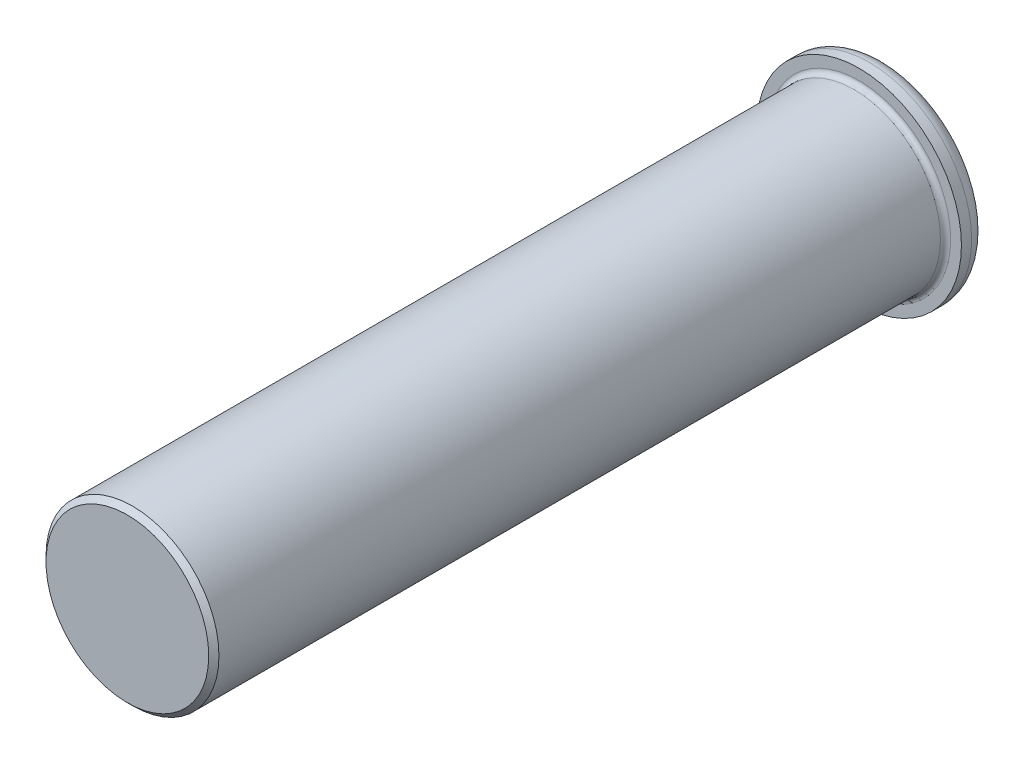
ISO-10303-21;
HEADER;
FILE_DESCRIPTION(('STEP AP214'),'2;1');
FILE_NAME('part.step','',(''),(''),'','','');
FILE_SCHEMA(('AUTOMOTIVE_DESIGN { 1 0 10303 214 1 1 1 1 }'));
ENDSEC;
DATA;
#1=APPLICATION_CONTEXT('core data for automotive mechanical design processes');
#2=APPLICATION_PROTOCOL_DEFINITION('international standard','automotive_design',2000,#1);
#3=PRODUCT_CONTEXT('',#1,'mechanical');
#4=PRODUCT('Part','Part','',(#3));
#5=PRODUCT_RELATED_PRODUCT_CATEGORY('part','',(#4));
#6=PRODUCT_DEFINITION_FORMATION('','',#4);
#7=PRODUCT_DEFINITION_CONTEXT('part definition',#1,'design');
#8=PRODUCT_DEFINITION('design','',#6,#7);
#9=PRODUCT_DEFINITION_SHAPE('','',#8);
#10=(LENGTH_UNIT() NAMED_UNIT(*) SI_UNIT(.MILLI.,.METRE.));
#11=(NAMED_UNIT(*) PLANE_ANGLE_UNIT() SI_UNIT($,.RADIAN.));
#12=(NAMED_UNIT(*) SI_UNIT($,.STERADIAN.) SOLID_ANGLE_UNIT());
#13=UNCERTAINTY_MEASURE_WITH_UNIT(LENGTH_MEASURE(1.E-05),#10,'distance_accuracy_value','');
#14=(GEOMETRIC_REPRESENTATION_CONTEXT(3) GLOBAL_UNCERTAINTY_ASSIGNED_CONTEXT((#13)) GLOBAL_UNIT_ASSIGNED_CONTEXT((#10,
#11,#12)) REPRESENTATION_CONTEXT('',''));
#15=CARTESIAN_POINT('',(0.,0.,0.));
#16=DIRECTION('',(0.,0.,1.));
#17=DIRECTION('',(1.,0.,0.));
#18=AXIS2_PLACEMENT_3D('',#15,#16,#17);
#19=CARTESIAN_POINT('',(0.,2.50561201349413,2.5));
#20=DIRECTION('',(0.,0.,1.));
#21=DIRECTION('',(1.,0.,0.));
#22=AXIS2_PLACEMENT_3D('',#19,#20,#21);
#23=PLANE('',#22);
#24=CARTESIAN_POINT('',(0.,2.50561201349413,2.5));
#25=DIRECTION('',(0.,0.,1.));
#26=DIRECTION('',(1.,0.,0.));
#27=AXIS2_PLACEMENT_3D('',#24,#25,#26);
#28=CIRCLE('',#27,8.95);
#29=CARTESIAN_POINT('',(8.95,2.50561201349413,2.5));
#30=VERTEX_POINT('',#29);
#31=EDGE_CURVE('E65',#30,#30,#28,.F.);
#32=ORIENTED_EDGE('',*,*,#31,.T.);
#33=EDGE_LOOP('',(#32));
#34=FACE_BOUND('',#33,.T.);
#35=CARTESIAN_POINT('',(0.,2.50561201349413,2.5));
#36=DIRECTION('',(0.,0.,1.));
#37=DIRECTION('',(1.,0.,0.));
#38=AXIS2_PLACEMENT_3D('',#35,#36,#37);
#39=CIRCLE('',#38,10.);
#40=CARTESIAN_POINT('',(10.,2.50561201349413,2.5));
#41=VERTEX_POINT('',#40);
#42=EDGE_CURVE('E71',#41,#41,#39,.T.);
#43=ORIENTED_EDGE('',*,*,#42,.T.);
#44=EDGE_LOOP('',(#43));
#45=FACE_BOUND('',#44,.T.);
#46=ADVANCED_FACE('F45',(#34,#45),#23,.T.);
#47=CARTESIAN_POINT('',(0.,2.50561201349413,2.5));
#48=DIRECTION('',(0.,0.,-1.));
#49=DIRECTION('',(-1.,0.,0.));
#50=AXIS2_PLACEMENT_3D('',#47,#48,#49);
#51=CYLINDRICAL_SURFACE('',#50,10.);
#52=CARTESIAN_POINT('',(0.,2.50561201349413,1.5));
#53=DIRECTION('',(0.,0.,1.));
#54=DIRECTION('',(1.,0.,0.));
#55=AXIS2_PLACEMENT_3D('',#52,#53,#54);
#56=CIRCLE('',#55,10.);
#57=CARTESIAN_POINT('',(10.,2.50561201349413,1.5));
#58=VERTEX_POINT('',#57);
#59=EDGE_CURVE('E52',#58,#58,#56,.T.);
#60=ORIENTED_EDGE('',*,*,#59,.T.);
#61=EDGE_LOOP('',(#60));
#62=FACE_BOUND('',#61,.T.);
#63=ORIENTED_EDGE('',*,*,#42,.F.);
#64=EDGE_LOOP('',(#63));
#65=FACE_BOUND('',#64,.T.);
#66=ADVANCED_FACE('F76',(#62,#65),#51,.T.);
#67=CARTESIAN_POINT('',(0.,2.50561201349413,0.));
#68=DIRECTION('',(0.,0.,1.));
#69=DIRECTION('',(1.,0.,0.));
#70=AXIS2_PLACEMENT_3D('',#67,#68,#69);
#71=PLANE('',#70);
#72=CARTESIAN_POINT('',(0.,2.50561201349413,0.));
#73=DIRECTION('',(0.,0.,1.));
#74=DIRECTION('',(1.,0.,0.));
#75=AXIS2_PLACEMENT_3D('',#72,#73,#74);
#76=CIRCLE('',#75,8.5);
#77=CARTESIAN_POINT('',(8.5,2.50561201349413,0.));
#78=VERTEX_POINT('',#77);
#79=EDGE_CURVE('E12',#78,#78,#76,.F.);
#80=ORIENTED_EDGE('',*,*,#79,.T.);
#81=EDGE_LOOP('',(#80));
#82=FACE_BOUND('',#81,.T.);
#83=ADVANCED_FACE('F78',(#82),#71,.F.);
#84=CARTESIAN_POINT('',(0.,2.50561201349414,74.));
#85=DIRECTION('',(0.,0.,-1.));
#86=DIRECTION('',(-1.,0.,0.));
#87=AXIS2_PLACEMENT_3D('',#84,#85,#86);
#88=CYLINDRICAL_SURFACE('',#87,8.45);
#89=CARTESIAN_POINT('',(0.,2.50561201349414,73.5));
#90=DIRECTION('',(0.,0.,1.));
#91=DIRECTION('',(1.,0.,0.));
#92=AXIS2_PLACEMENT_3D('',#89,#90,#91);
#93=CIRCLE('',#92,8.45);
#94=CARTESIAN_POINT('',(8.45,2.50561201349414,73.5));
#95=VERTEX_POINT('',#94);
#96=EDGE_CURVE('E56',#95,#95,#93,.F.);
#97=ORIENTED_EDGE('',*,*,#96,.T.);
#98=EDGE_LOOP('',(#97));
#99=FACE_BOUND('',#98,.T.);
#100=CARTESIAN_POINT('',(0.,2.50561201349413,3.));
#101=DIRECTION('',(0.,0.,1.));
#102=DIRECTION('',(1.,0.,0.));
#103=AXIS2_PLACEMENT_3D('',#100,#101,#102);
#104=CIRCLE('',#103,8.45);
#105=CARTESIAN_POINT('',(8.45,2.50561201349413,3.));
#106=VERTEX_POINT('',#105);
#107=EDGE_CURVE('E68',#106,#106,#104,.T.);
#108=ORIENTED_EDGE('',*,*,#107,.T.);
#109=EDGE_LOOP('',(#108));
#110=FACE_BOUND('',#109,.T.);
#111=ADVANCED_FACE('F84',(#99,#110),#88,.T.);
#112=CARTESIAN_POINT('',(0.,2.50561201349414,74.));
#113=DIRECTION('',(0.,0.,1.));
#114=DIRECTION('',(1.,0.,0.));
#115=AXIS2_PLACEMENT_3D('',#112,#113,#114);
#116=PLANE('',#115);
#117=CARTESIAN_POINT('',(0.,2.50561201349414,74.));
#118=DIRECTION('',(0.,0.,1.));
#119=DIRECTION('',(1.,0.,0.));
#120=AXIS2_PLACEMENT_3D('',#117,#118,#119);
#121=CIRCLE('',#120,7.94999999999999);
#122=CARTESIAN_POINT('',(7.94999999999999,2.50561201349414,74.));
#123=VERTEX_POINT('',#122);
#124=EDGE_CURVE('E60',#123,#123,#121,.T.);
#125=ORIENTED_EDGE('',*,*,#124,.T.);
#126=EDGE_LOOP('',(#125));
#127=FACE_BOUND('',#126,.T.);
#128=ADVANCED_FACE('F92',(#127),#116,.T.);
#129=CARTESIAN_POINT('',(0.,2.50561201349413,3.));
#130=DIRECTION('',(0.,0.,1.));
#131=DIRECTION('',(1.,0.,0.));
#132=AXIS2_PLACEMENT_3D('',#129,#130,#131);
#133=TOROIDAL_SURFACE('',#132,8.95,0.5);
#134=ORIENTED_EDGE('',*,*,#31,.F.);
#135=EDGE_LOOP('',(#134));
#136=FACE_BOUND('',#135,.T.);
#137=ORIENTED_EDGE('',*,*,#107,.F.);
#138=EDGE_LOOP('',(#137));
#139=FACE_BOUND('',#138,.T.);
#140=ADVANCED_FACE('F89',(#136,#139),#133,.F.);
#141=CARTESIAN_POINT('',(0.,2.50561201349414,74.));
#142=DIRECTION('',(0.,0.,-1.));
#143=DIRECTION('',(-1.,0.,0.));
#144=AXIS2_PLACEMENT_3D('',#141,#142,#143);
#145=CONICAL_SURFACE('',#144,7.94999999999999,0.785398163397455);
#146=ORIENTED_EDGE('',*,*,#96,.F.);
#147=EDGE_LOOP('',(#146));
#148=FACE_BOUND('',#147,.T.);
#149=ORIENTED_EDGE('',*,*,#124,.F.);
#150=EDGE_LOOP('',(#149));
#151=FACE_BOUND('',#150,.T.);
#152=ADVANCED_FACE('F91',(#148,#151),#145,.T.);
#153=CARTESIAN_POINT('',(0.,2.50561201349413,1.5));
#154=DIRECTION('',(0.,0.,1.));
#155=DIRECTION('',(1.,0.,0.));
#156=AXIS2_PLACEMENT_3D('',#153,#154,#155);
#157=TOROIDAL_SURFACE('',#156,8.5,1.5);
#158=ORIENTED_EDGE('',*,*,#79,.F.);
#159=EDGE_LOOP('',(#158));
#160=FACE_BOUND('',#159,.T.);
#161=ORIENTED_EDGE('',*,*,#59,.F.);
#162=EDGE_LOOP('',(#161));
#163=FACE_BOUND('',#162,.T.);
#164=ADVANCED_FACE('F47',(#160,#163),#157,.T.);
#165=CLOSED_SHELL('',(#46,#66,#83,#111,#128,#140,#152,#164));
#166=MANIFOLD_SOLID_BREP('B2',#165);
#167=ADVANCED_BREP_SHAPE_REPRESENTATION('',(#18,#166),#14);
#168=SHAPE_DEFINITION_REPRESENTATION(#9,#167);
ENDSEC;
END-ISO-10303-21;
